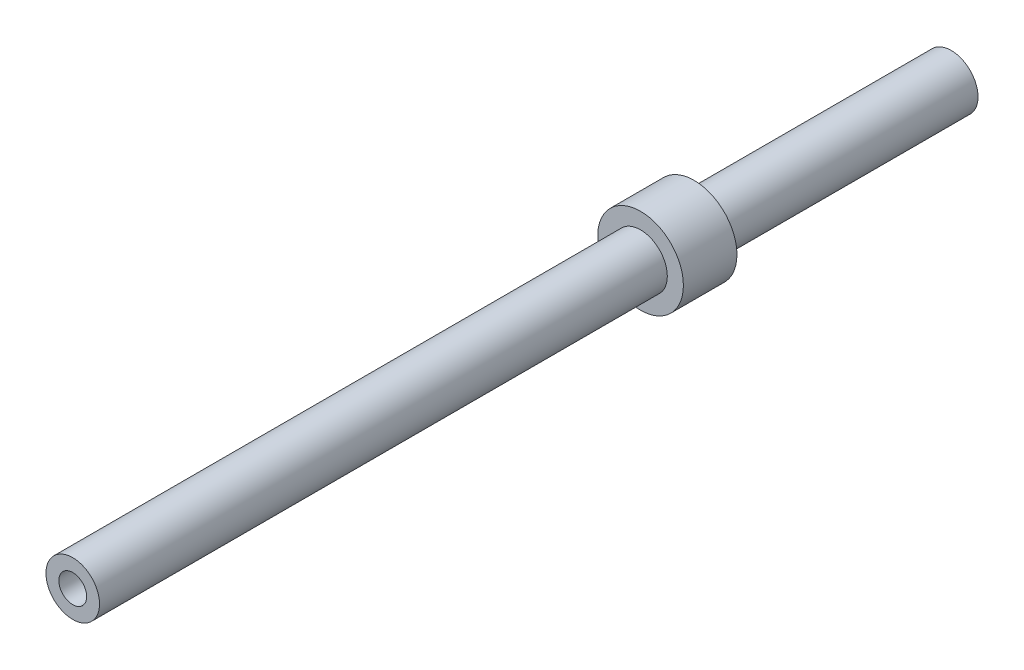
ISO-10303-21;
HEADER;
FILE_DESCRIPTION(('STEP AP214'),'2;1');
FILE_NAME('part.step','',(''),(''),'','','');
FILE_SCHEMA(('AUTOMOTIVE_DESIGN { 1 0 10303 214 1 1 1 1 }'));
ENDSEC;
DATA;
#1=APPLICATION_CONTEXT('core data for automotive mechanical design processes');
#2=APPLICATION_PROTOCOL_DEFINITION('international standard','automotive_design',2000,#1);
#3=PRODUCT_CONTEXT('',#1,'mechanical');
#4=PRODUCT('Part','Part','',(#3));
#5=PRODUCT_RELATED_PRODUCT_CATEGORY('part','',(#4));
#6=PRODUCT_DEFINITION_FORMATION('','',#4);
#7=PRODUCT_DEFINITION_CONTEXT('part definition',#1,'design');
#8=PRODUCT_DEFINITION('design','',#6,#7);
#9=PRODUCT_DEFINITION_SHAPE('','',#8);
#10=(LENGTH_UNIT() NAMED_UNIT(*) SI_UNIT(.MILLI.,.METRE.));
#11=(NAMED_UNIT(*) PLANE_ANGLE_UNIT() SI_UNIT($,.RADIAN.));
#12=(NAMED_UNIT(*) SI_UNIT($,.STERADIAN.) SOLID_ANGLE_UNIT());
#13=UNCERTAINTY_MEASURE_WITH_UNIT(LENGTH_MEASURE(1.E-05),#10,'distance_accuracy_value','');
#14=(GEOMETRIC_REPRESENTATION_CONTEXT(3) GLOBAL_UNCERTAINTY_ASSIGNED_CONTEXT((#13)) GLOBAL_UNIT_ASSIGNED_CONTEXT((#10,
#11,#12)) REPRESENTATION_CONTEXT('',''));
#15=CARTESIAN_POINT('',(0.,0.,0.));
#16=DIRECTION('',(0.,0.,1.));
#17=DIRECTION('',(1.,0.,0.));
#18=AXIS2_PLACEMENT_3D('',#15,#16,#17);
#19=CARTESIAN_POINT('',(0.,0.,24.));
#20=DIRECTION('',(0.,0.,-1.));
#21=DIRECTION('',(-1.,0.,0.));
#22=AXIS2_PLACEMENT_3D('',#19,#20,#21);
#23=CYLINDRICAL_SURFACE('',#22,2.5);
#24=CARTESIAN_POINT('',(0.,0.,24.));
#25=DIRECTION('',(0.,0.,1.));
#26=DIRECTION('',(1.,0.,0.));
#27=AXIS2_PLACEMENT_3D('',#24,#25,#26);
#28=CIRCLE('',#27,2.5);
#29=CARTESIAN_POINT('',(2.5,0.,24.));
#30=VERTEX_POINT('',#29);
#31=EDGE_CURVE('E58',#30,#30,#28,.T.);
#32=ORIENTED_EDGE('',*,*,#31,.F.);
#33=EDGE_LOOP('',(#32));
#34=FACE_BOUND('',#33,.T.);
#35=CARTESIAN_POINT('',(0.,0.,0.));
#36=DIRECTION('',(0.,0.,1.));
#37=DIRECTION('',(1.,0.,0.));
#38=AXIS2_PLACEMENT_3D('',#35,#36,#37);
#39=CIRCLE('',#38,2.5);
#40=CARTESIAN_POINT('',(2.5,0.,0.));
#41=VERTEX_POINT('',#40);
#42=EDGE_CURVE('E52',#41,#41,#39,.T.);
#43=ORIENTED_EDGE('',*,*,#42,.T.);
#44=EDGE_LOOP('',(#43));
#45=FACE_BOUND('',#44,.T.);
#46=ADVANCED_FACE('F49',(#34,#45),#23,.T.);
#47=CARTESIAN_POINT('',(0.,0.,0.));
#48=DIRECTION('',(0.,0.,1.));
#49=DIRECTION('',(1.,0.,0.));
#50=AXIS2_PLACEMENT_3D('',#47,#48,#49);
#51=PLANE('',#50);
#52=CARTESIAN_POINT('',(0.,0.,0.));
#53=DIRECTION('',(0.,0.,-1.));
#54=DIRECTION('',(-1.,0.,0.));
#55=AXIS2_PLACEMENT_3D('',#52,#53,#54);
#56=CIRCLE('',#55,1.29999999999999);
#57=CARTESIAN_POINT('',(-1.29999999999999,0.,0.));
#58=VERTEX_POINT('',#57);
#59=EDGE_CURVE('E77',#58,#58,#56,.T.);
#60=ORIENTED_EDGE('',*,*,#59,.F.);
#61=EDGE_LOOP('',(#60));
#62=FACE_BOUND('',#61,.T.);
#63=ORIENTED_EDGE('',*,*,#42,.F.);
#64=EDGE_LOOP('',(#63));
#65=FACE_BOUND('',#64,.T.);
#66=ADVANCED_FACE('F110',(#62,#65),#51,.F.);
#67=CARTESIAN_POINT('',(0.,0.,29.));
#68=DIRECTION('',(0.,0.,-1.));
#69=DIRECTION('',(-1.,0.,0.));
#70=AXIS2_PLACEMENT_3D('',#67,#68,#69);
#71=CYLINDRICAL_SURFACE('',#70,4.);
#72=CARTESIAN_POINT('',(0.,0.,29.));
#73=DIRECTION('',(0.,0.,1.));
#74=DIRECTION('',(1.,0.,0.));
#75=AXIS2_PLACEMENT_3D('',#72,#73,#74);
#76=CIRCLE('',#75,4.);
#77=CARTESIAN_POINT('',(4.,0.,29.));
#78=VERTEX_POINT('',#77);
#79=EDGE_CURVE('E95',#78,#78,#76,.T.);
#80=ORIENTED_EDGE('',*,*,#79,.F.);
#81=EDGE_LOOP('',(#80));
#82=FACE_BOUND('',#81,.T.);
#83=CARTESIAN_POINT('',(0.,0.,24.));
#84=DIRECTION('',(0.,0.,1.));
#85=DIRECTION('',(1.,0.,0.));
#86=AXIS2_PLACEMENT_3D('',#83,#84,#85);
#87=CIRCLE('',#86,4.);
#88=CARTESIAN_POINT('',(4.,0.,24.));
#89=VERTEX_POINT('',#88);
#90=EDGE_CURVE('E93',#89,#89,#87,.T.);
#91=ORIENTED_EDGE('',*,*,#90,.T.);
#92=EDGE_LOOP('',(#91));
#93=FACE_BOUND('',#92,.T.);
#94=ADVANCED_FACE('F112',(#82,#93),#71,.T.);
#95=CARTESIAN_POINT('',(0.,0.,29.));
#96=DIRECTION('',(0.,0.,1.));
#97=DIRECTION('',(1.,0.,0.));
#98=AXIS2_PLACEMENT_3D('',#95,#96,#97);
#99=PLANE('',#98);
#100=CARTESIAN_POINT('',(0.,0.,29.));
#101=DIRECTION('',(0.,0.,1.));
#102=DIRECTION('',(1.,0.,0.));
#103=AXIS2_PLACEMENT_3D('',#100,#101,#102);
#104=CIRCLE('',#103,2.5);
#105=CARTESIAN_POINT('',(2.5,0.,29.));
#106=VERTEX_POINT('',#105);
#107=EDGE_CURVE('E11',#106,#106,#104,.T.);
#108=ORIENTED_EDGE('',*,*,#107,.F.);
#109=EDGE_LOOP('',(#108));
#110=FACE_BOUND('',#109,.T.);
#111=ORIENTED_EDGE('',*,*,#79,.T.);
#112=EDGE_LOOP('',(#111));
#113=FACE_BOUND('',#112,.T.);
#114=ADVANCED_FACE('F118',(#110,#113),#99,.T.);
#115=CARTESIAN_POINT('',(0.,0.,24.));
#116=DIRECTION('',(0.,0.,1.));
#117=DIRECTION('',(1.,0.,0.));
#118=AXIS2_PLACEMENT_3D('',#115,#116,#117);
#119=PLANE('',#118);
#120=ORIENTED_EDGE('',*,*,#31,.T.);
#121=EDGE_LOOP('',(#120));
#122=FACE_BOUND('',#121,.T.);
#123=ORIENTED_EDGE('',*,*,#90,.F.);
#124=EDGE_LOOP('',(#123));
#125=FACE_BOUND('',#124,.T.);
#126=ADVANCED_FACE('F124',(#122,#125),#119,.F.);
#127=CARTESIAN_POINT('',(0.,0.,82.));
#128=DIRECTION('',(0.,0.,-1.));
#129=DIRECTION('',(-1.,0.,0.));
#130=AXIS2_PLACEMENT_3D('',#127,#128,#129);
#131=CYLINDRICAL_SURFACE('',#130,2.5);
#132=CARTESIAN_POINT('',(0.,0.,82.));
#133=DIRECTION('',(0.,0.,1.));
#134=DIRECTION('',(1.,0.,0.));
#135=AXIS2_PLACEMENT_3D('',#132,#133,#134);
#136=CIRCLE('',#135,2.5);
#137=CARTESIAN_POINT('',(2.5,0.,82.));
#138=VERTEX_POINT('',#137);
#139=EDGE_CURVE('E90',#138,#138,#136,.T.);
#140=ORIENTED_EDGE('',*,*,#139,.F.);
#141=EDGE_LOOP('',(#140));
#142=FACE_BOUND('',#141,.T.);
#143=ORIENTED_EDGE('',*,*,#107,.T.);
#144=EDGE_LOOP('',(#143));
#145=FACE_BOUND('',#144,.T.);
#146=ADVANCED_FACE('F127',(#142,#145),#131,.T.);
#147=CARTESIAN_POINT('',(0.,0.,82.));
#148=DIRECTION('',(0.,0.,1.));
#149=DIRECTION('',(1.,0.,0.));
#150=AXIS2_PLACEMENT_3D('',#147,#148,#149);
#151=PLANE('',#150);
#152=CARTESIAN_POINT('',(0.,0.,82.));
#153=DIRECTION('',(0.,0.,1.));
#154=DIRECTION('',(1.,0.,0.));
#155=AXIS2_PLACEMENT_3D('',#152,#153,#154);
#156=CIRCLE('',#155,1.29999999999999);
#157=CARTESIAN_POINT('',(1.29999999999999,0.,82.));
#158=VERTEX_POINT('',#157);
#159=EDGE_CURVE('E76',#158,#158,#156,.T.);
#160=ORIENTED_EDGE('',*,*,#159,.F.);
#161=EDGE_LOOP('',(#160));
#162=FACE_BOUND('',#161,.T.);
#163=ORIENTED_EDGE('',*,*,#139,.T.);
#164=EDGE_LOOP('',(#163));
#165=FACE_BOUND('',#164,.T.);
#166=ADVANCED_FACE('F133',(#162,#165),#151,.T.);
#167=CARTESIAN_POINT('',(0.,0.,74.));
#168=DIRECTION('',(0.,0.,1.));
#169=DIRECTION('',(1.,0.,0.));
#170=AXIS2_PLACEMENT_3D('',#167,#168,#169);
#171=CONICAL_SURFACE('',#170,1.29999999999999,1.02974425867665);
#172=CARTESIAN_POINT('',(0.,0.,73.2188811952642));
#173=VERTEX_POINT('',#172);
#174=VERTEX_LOOP('',#173);
#175=FACE_BOUND('',#174,.T.);
#176=CARTESIAN_POINT('',(0.,0.,74.));
#177=DIRECTION('',(0.,0.,1.));
#178=DIRECTION('',(1.,0.,0.));
#179=AXIS2_PLACEMENT_3D('',#176,#177,#178);
#180=CIRCLE('',#179,1.29999999999999);
#181=CARTESIAN_POINT('',(1.29999999999999,0.,74.));
#182=VERTEX_POINT('',#181);
#183=EDGE_CURVE('E82',#182,#182,#180,.T.);
#184=ORIENTED_EDGE('',*,*,#183,.T.);
#185=EDGE_LOOP('',(#184));
#186=FACE_BOUND('',#185,.T.);
#187=ADVANCED_FACE('F137',(#175,#186),#171,.F.);
#188=CARTESIAN_POINT('',(0.,0.,82.));
#189=DIRECTION('',(0.,0.,1.));
#190=DIRECTION('',(1.,0.,0.));
#191=AXIS2_PLACEMENT_3D('',#188,#189,#190);
#192=CYLINDRICAL_SURFACE('',#191,1.29999999999999);
#193=ORIENTED_EDGE('',*,*,#183,.F.);
#194=EDGE_LOOP('',(#193));
#195=FACE_BOUND('',#194,.T.);
#196=ORIENTED_EDGE('',*,*,#159,.T.);
#197=EDGE_LOOP('',(#196));
#198=FACE_BOUND('',#197,.T.);
#199=ADVANCED_FACE('F69',(#195,#198),#192,.F.);
#200=CARTESIAN_POINT('',(0.,0.,7.99999999999999));
#201=DIRECTION('',(0.,0.,-1.));
#202=DIRECTION('',(-1.,0.,0.));
#203=AXIS2_PLACEMENT_3D('',#200,#201,#202);
#204=CONICAL_SURFACE('',#203,1.29999999999999,1.02974425867665);
#205=CARTESIAN_POINT('',(0.,0.,8.78111880473583));
#206=VERTEX_POINT('',#205);
#207=VERTEX_LOOP('',#206);
#208=FACE_BOUND('',#207,.T.);
#209=CARTESIAN_POINT('',(0.,0.,7.99999999999999));
#210=DIRECTION('',(0.,0.,-1.));
#211=DIRECTION('',(-1.,0.,0.));
#212=AXIS2_PLACEMENT_3D('',#209,#210,#211);
#213=CIRCLE('',#212,1.29999999999999);
#214=CARTESIAN_POINT('',(-1.29999999999999,0.,7.99999999999999));
#215=VERTEX_POINT('',#214);
#216=EDGE_CURVE('E73',#215,#215,#213,.T.);
#217=ORIENTED_EDGE('',*,*,#216,.T.);
#218=EDGE_LOOP('',(#217));
#219=FACE_BOUND('',#218,.T.);
#220=ADVANCED_FACE('F65',(#208,#219),#204,.F.);
#221=CARTESIAN_POINT('',(0.,0.,0.));
#222=DIRECTION('',(0.,0.,-1.));
#223=DIRECTION('',(-1.,0.,0.));
#224=AXIS2_PLACEMENT_3D('',#221,#222,#223);
#225=CYLINDRICAL_SURFACE('',#224,1.29999999999999);
#226=ORIENTED_EDGE('',*,*,#216,.F.);
#227=EDGE_LOOP('',(#226));
#228=FACE_BOUND('',#227,.T.);
#229=ORIENTED_EDGE('',*,*,#59,.T.);
#230=EDGE_LOOP('',(#229));
#231=FACE_BOUND('',#230,.T.);
#232=ADVANCED_FACE('F68',(#228,#231),#225,.F.);
#233=CLOSED_SHELL('',(#46,#66,#94,#114,#126,#146,#166,#187,#199,#220,#232));
#234=MANIFOLD_SOLID_BREP('B2',#233);
#235=ADVANCED_BREP_SHAPE_REPRESENTATION('',(#18,#234),#14);
#236=SHAPE_DEFINITION_REPRESENTATION(#9,#235);
ENDSEC;
END-ISO-10303-21;
